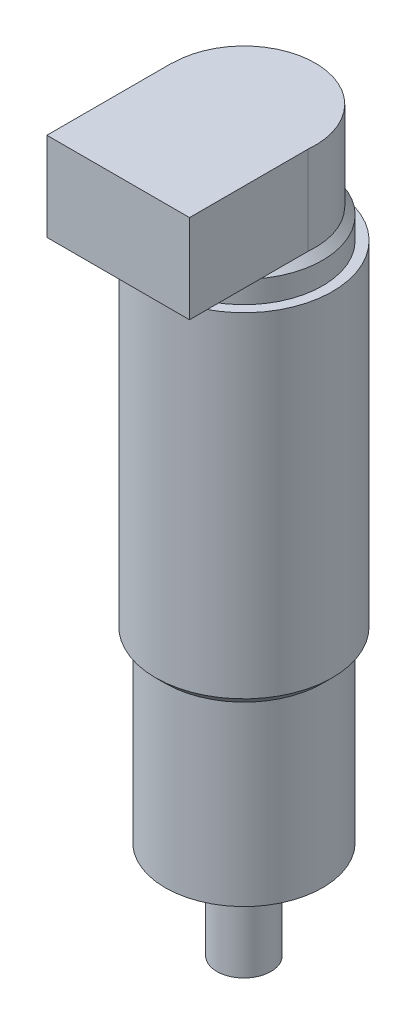
ISO-10303-21;
HEADER;
FILE_DESCRIPTION(('STEP AP214'),'2;1');
FILE_NAME('part.step','',(''),(''),'','','');
FILE_SCHEMA(('AUTOMOTIVE_DESIGN { 1 0 10303 214 1 1 1 1 }'));
ENDSEC;
DATA;
#1=APPLICATION_CONTEXT('core data for automotive mechanical design processes');
#2=APPLICATION_PROTOCOL_DEFINITION('international standard','automotive_design',2000,#1);
#3=PRODUCT_CONTEXT('',#1,'mechanical');
#4=PRODUCT('Part','Part','',(#3));
#5=PRODUCT_RELATED_PRODUCT_CATEGORY('part','',(#4));
#6=PRODUCT_DEFINITION_FORMATION('','',#4);
#7=PRODUCT_DEFINITION_CONTEXT('part definition',#1,'design');
#8=PRODUCT_DEFINITION('design','',#6,#7);
#9=PRODUCT_DEFINITION_SHAPE('','',#8);
#10=(LENGTH_UNIT() NAMED_UNIT(*) SI_UNIT(.MILLI.,.METRE.));
#11=(NAMED_UNIT(*) PLANE_ANGLE_UNIT() SI_UNIT($,.RADIAN.));
#12=(NAMED_UNIT(*) SI_UNIT($,.STERADIAN.) SOLID_ANGLE_UNIT());
#13=UNCERTAINTY_MEASURE_WITH_UNIT(LENGTH_MEASURE(1.E-05),#10,'distance_accuracy_value','');
#14=(GEOMETRIC_REPRESENTATION_CONTEXT(3) GLOBAL_UNCERTAINTY_ASSIGNED_CONTEXT((#13)) GLOBAL_UNIT_ASSIGNED_CONTEXT((#10,
#11,#12)) REPRESENTATION_CONTEXT('',''));
#15=CARTESIAN_POINT('',(0.,0.,0.));
#16=DIRECTION('',(0.,0.,1.));
#17=DIRECTION('',(1.,0.,0.));
#18=AXIS2_PLACEMENT_3D('',#15,#16,#17);
#19=CARTESIAN_POINT('',(0.,0.,0.));
#20=DIRECTION('',(0.,1.,0.));
#21=DIRECTION('',(0.,0.,1.));
#22=AXIS2_PLACEMENT_3D('',#19,#20,#21);
#23=PLANE('',#22);
#24=CARTESIAN_POINT('',(0.,0.,0.));
#25=DIRECTION('',(0.,1.,0.));
#26=DIRECTION('',(0.,0.,1.));
#27=AXIS2_PLACEMENT_3D('',#24,#25,#26);
#28=CIRCLE('',#27,16.);
#29=CARTESIAN_POINT('',(0.,0.,16.));
#30=VERTEX_POINT('',#29);
#31=EDGE_CURVE('E124',#30,#30,#28,.T.);
#32=ORIENTED_EDGE('',*,*,#31,.F.);
#33=EDGE_LOOP('',(#32));
#34=FACE_BOUND('',#33,.T.);
#35=CARTESIAN_POINT('',(0.,0.,0.));
#36=DIRECTION('',(0.,1.,0.));
#37=DIRECTION('',(0.,0.,1.));
#38=AXIS2_PLACEMENT_3D('',#35,#36,#37);
#39=CIRCLE('',#38,5.5);
#40=CARTESIAN_POINT('',(0.,0.,5.5));
#41=VERTEX_POINT('',#40);
#42=EDGE_CURVE('E11',#41,#41,#39,.F.);
#43=ORIENTED_EDGE('',*,*,#42,.F.);
#44=EDGE_LOOP('',(#43));
#45=FACE_BOUND('',#44,.T.);
#46=ADVANCED_FACE('F32',(#34,#45),#23,.F.);
#47=CARTESIAN_POINT('',(0.,130.,0.));
#48=DIRECTION('',(0.,-1.,0.));
#49=DIRECTION('',(0.,0.,-1.));
#50=AXIS2_PLACEMENT_3D('',#47,#48,#49);
#51=CYLINDRICAL_SURFACE('',#50,14.5);
#52=DIRECTION('',(0.,-1.,0.));
#53=VECTOR('',#52,1.);
#54=CARTESIAN_POINT('',(14.436167806906,130.,1.35906550646009));
#55=LINE('',#54,#53);
#56=CARTESIAN_POINT('',(14.436167806906,112.,1.35906550646005));
#57=VERTEX_POINT('',#56);
#58=CARTESIAN_POINT('',(14.436167806906,130.,1.35906550646009));
#59=VERTEX_POINT('',#58);
#60=EDGE_CURVE('E106',#57,#59,#55,.F.);
#61=ORIENTED_EDGE('',*,*,#60,.F.);
#62=CARTESIAN_POINT('',(0.,112.,0.));
#63=DIRECTION('',(0.,1.,0.));
#64=DIRECTION('',(0.,0.,1.));
#65=AXIS2_PLACEMENT_3D('',#62,#63,#64);
#66=CIRCLE('',#65,14.5);
#67=CARTESIAN_POINT('',(-14.5,112.,0.));
#68=VERTEX_POINT('',#67);
#69=EDGE_CURVE('E117',#57,#68,#66,.T.);
#70=ORIENTED_EDGE('',*,*,#69,.T.);
#71=DIRECTION('',(0.,-1.,0.));
#72=VECTOR('',#71,1.);
#73=CARTESIAN_POINT('',(-14.5,130.,0.));
#74=LINE('',#73,#72);
#75=CARTESIAN_POINT('',(-14.5,130.,0.));
#76=VERTEX_POINT('',#75);
#77=EDGE_CURVE('E47',#76,#68,#74,.T.);
#78=ORIENTED_EDGE('',*,*,#77,.F.);
#79=CARTESIAN_POINT('',(0.,130.,0.));
#80=DIRECTION('',(0.,1.,0.));
#81=DIRECTION('',(0.,0.,1.));
#82=AXIS2_PLACEMENT_3D('',#79,#80,#81);
#83=CIRCLE('',#82,14.5);
#84=EDGE_CURVE('E51',#59,#76,#83,.T.);
#85=ORIENTED_EDGE('',*,*,#84,.F.);
#86=EDGE_LOOP('',(#61,#70,#78,#85));
#87=FACE_BOUND('',#86,.T.);
#88=ADVANCED_FACE('F142',(#87),#51,.T.);
#89=CARTESIAN_POINT('',(0.,106.,0.));
#90=DIRECTION('',(0.,1.,0.));
#91=DIRECTION('',(0.,0.,1.));
#92=AXIS2_PLACEMENT_3D('',#89,#90,#91);
#93=PLANE('',#92);
#94=CARTESIAN_POINT('',(0.,106.,0.));
#95=DIRECTION('',(0.,1.,0.));
#96=DIRECTION('',(0.,0.,1.));
#97=AXIS2_PLACEMENT_3D('',#94,#95,#96);
#98=CIRCLE('',#97,18.);
#99=CARTESIAN_POINT('',(0.,106.,18.));
#100=VERTEX_POINT('',#99);
#101=EDGE_CURVE('E121',#100,#100,#98,.T.);
#102=ORIENTED_EDGE('',*,*,#101,.T.);
#103=EDGE_LOOP('',(#102));
#104=FACE_BOUND('',#103,.T.);
#105=CARTESIAN_POINT('',(0.,106.,0.));
#106=DIRECTION('',(0.,1.,0.));
#107=DIRECTION('',(0.,0.,1.));
#108=AXIS2_PLACEMENT_3D('',#105,#106,#107);
#109=CIRCLE('',#108,16.);
#110=CARTESIAN_POINT('',(0.,106.,16.));
#111=VERTEX_POINT('',#110);
#112=EDGE_CURVE('E116',#111,#111,#109,.T.);
#113=ORIENTED_EDGE('',*,*,#112,.F.);
#114=EDGE_LOOP('',(#113));
#115=FACE_BOUND('',#114,.T.);
#116=ADVANCED_FACE('F172',(#104,#115),#93,.T.);
#117=CARTESIAN_POINT('',(0.,36.,0.));
#118=DIRECTION('',(0.,-1.,0.));
#119=DIRECTION('',(0.,0.,-1.));
#120=AXIS2_PLACEMENT_3D('',#117,#118,#119);
#121=CYLINDRICAL_SURFACE('',#120,16.);
#122=CARTESIAN_POINT('',(0.,36.,0.));
#123=DIRECTION('',(0.,1.,0.));
#124=DIRECTION('',(0.,0.,1.));
#125=AXIS2_PLACEMENT_3D('',#122,#123,#124);
#126=CIRCLE('',#125,16.);
#127=CARTESIAN_POINT('',(0.,36.,16.));
#128=VERTEX_POINT('',#127);
#129=EDGE_CURVE('E125',#128,#128,#126,.T.);
#130=ORIENTED_EDGE('',*,*,#129,.F.);
#131=EDGE_LOOP('',(#130));
#132=FACE_BOUND('',#131,.T.);
#133=ORIENTED_EDGE('',*,*,#31,.T.);
#134=EDGE_LOOP('',(#133));
#135=FACE_BOUND('',#134,.T.);
#136=ADVANCED_FACE('F180',(#132,#135),#121,.T.);
#137=CARTESIAN_POINT('',(0.,106.,0.));
#138=DIRECTION('',(0.,-1.,0.));
#139=DIRECTION('',(0.,0.,-1.));
#140=AXIS2_PLACEMENT_3D('',#137,#138,#139);
#141=CYLINDRICAL_SURFACE('',#140,18.);
#142=CARTESIAN_POINT('',(0.,38.,0.));
#143=DIRECTION('',(0.,1.,0.));
#144=DIRECTION('',(0.,0.,1.));
#145=AXIS2_PLACEMENT_3D('',#142,#143,#144);
#146=CIRCLE('',#145,18.);
#147=CARTESIAN_POINT('',(0.,38.,18.));
#148=VERTEX_POINT('',#147);
#149=EDGE_CURVE('E128',#148,#148,#146,.T.);
#150=ORIENTED_EDGE('',*,*,#149,.T.);
#151=EDGE_LOOP('',(#150));
#152=FACE_BOUND('',#151,.T.);
#153=ORIENTED_EDGE('',*,*,#101,.F.);
#154=EDGE_LOOP('',(#153));
#155=FACE_BOUND('',#154,.T.);
#156=ADVANCED_FACE('F178',(#152,#155),#141,.T.);
#157=CARTESIAN_POINT('',(0.,38.,0.));
#158=DIRECTION('',(0.,1.,0.));
#159=DIRECTION('',(0.,0.,1.));
#160=AXIS2_PLACEMENT_3D('',#157,#158,#159);
#161=CONICAL_SURFACE('',#160,18.,0.785398163397454);
#162=ORIENTED_EDGE('',*,*,#129,.T.);
#163=EDGE_LOOP('',(#162));
#164=FACE_BOUND('',#163,.T.);
#165=ORIENTED_EDGE('',*,*,#149,.F.);
#166=EDGE_LOOP('',(#165));
#167=FACE_BOUND('',#166,.T.);
#168=ADVANCED_FACE('F183',(#164,#167),#161,.T.);
#169=CARTESIAN_POINT('',(0.,112.,0.));
#170=DIRECTION('',(0.,-1.,0.));
#171=DIRECTION('',(0.,0.,-1.));
#172=AXIS2_PLACEMENT_3D('',#169,#170,#171);
#173=CYLINDRICAL_SURFACE('',#172,16.);
#174=CARTESIAN_POINT('',(0.,110.5,0.));
#175=DIRECTION('',(0.,1.,0.));
#176=DIRECTION('',(0.,0.,1.));
#177=AXIS2_PLACEMENT_3D('',#174,#175,#176);
#178=CIRCLE('',#177,16.);
#179=CARTESIAN_POINT('',(0.,110.5,16.));
#180=VERTEX_POINT('',#179);
#181=EDGE_CURVE('E40',#180,#180,#178,.F.);
#182=ORIENTED_EDGE('',*,*,#181,.T.);
#183=EDGE_LOOP('',(#182));
#184=FACE_BOUND('',#183,.T.);
#185=ORIENTED_EDGE('',*,*,#112,.T.);
#186=EDGE_LOOP('',(#185));
#187=FACE_BOUND('',#186,.T.);
#188=ADVANCED_FACE('F135',(#184,#187),#173,.T.);
#189=CARTESIAN_POINT('',(0.,130.,0.));
#190=DIRECTION('',(0.,1.,0.));
#191=DIRECTION('',(0.,0.,1.));
#192=AXIS2_PLACEMENT_3D('',#189,#190,#191);
#193=PLANE('',#192);
#194=ORIENTED_EDGE('',*,*,#84,.T.);
#195=DIRECTION('',(-1.,0.,0.));
#196=VECTOR('',#195,1.);
#197=CARTESIAN_POINT('',(-14.563832193094,130.,0.));
#198=LINE('',#197,#196);
#199=CARTESIAN_POINT('',(-14.563832193094,130.,0.));
#200=VERTEX_POINT('',#199);
#201=EDGE_CURVE('E101',#76,#200,#198,.T.);
#202=ORIENTED_EDGE('',*,*,#201,.T.);
#203=DIRECTION('',(0.,0.,-1.));
#204=VECTOR('',#203,1.);
#205=CARTESIAN_POINT('',(-14.563832193094,130.,25.5));
#206=LINE('',#205,#204);
#207=CARTESIAN_POINT('',(-14.563832193094,130.,25.5));
#208=VERTEX_POINT('',#207);
#209=EDGE_CURVE('E149',#208,#200,#206,.T.);
#210=ORIENTED_EDGE('',*,*,#209,.F.);
#211=DIRECTION('',(-1.,0.,0.));
#212=VECTOR('',#211,1.);
#213=CARTESIAN_POINT('',(-14.563832193094,130.,25.5));
#214=LINE('',#213,#212);
#215=CARTESIAN_POINT('',(14.436167806906,130.,25.5));
#216=VERTEX_POINT('',#215);
#217=EDGE_CURVE('E97',#216,#208,#214,.T.);
#218=ORIENTED_EDGE('',*,*,#217,.F.);
#219=DIRECTION('',(0.,0.,-1.));
#220=VECTOR('',#219,1.);
#221=CARTESIAN_POINT('',(14.436167806906,130.,25.5));
#222=LINE('',#221,#220);
#223=EDGE_CURVE('E109',#216,#59,#222,.T.);
#224=ORIENTED_EDGE('',*,*,#223,.T.);
#225=EDGE_LOOP('',(#194,#202,#210,#218,#224));
#226=FACE_BOUND('',#225,.T.);
#227=ADVANCED_FACE('F141',(#226),#193,.T.);
#228=CARTESIAN_POINT('',(0.,112.,0.));
#229=DIRECTION('',(0.,-1.,0.));
#230=DIRECTION('',(0.,0.,-1.));
#231=AXIS2_PLACEMENT_3D('',#228,#229,#230);
#232=CONICAL_SURFACE('',#231,14.5,0.785398163397453);
#233=ORIENTED_EDGE('',*,*,#181,.F.);
#234=EDGE_LOOP('',(#233));
#235=FACE_BOUND('',#234,.T.);
#236=ORIENTED_EDGE('',*,*,#69,.F.);
#237=EDGE_CURVE('E114',#68,#57,#66,.T.);
#238=ORIENTED_EDGE('',*,*,#237,.F.);
#239=EDGE_LOOP('',(#236,#238));
#240=FACE_BOUND('',#239,.T.);
#241=ADVANCED_FACE('F34',(#235,#240),#232,.T.);
#242=CARTESIAN_POINT('',(0.,0.,0.));
#243=DIRECTION('',(0.,0.,1.));
#244=DIRECTION('',(1.,0.,0.));
#245=AXIS2_PLACEMENT_3D('',#242,#243,#244);
#246=PLANE('',#245);
#247=ORIENTED_EDGE('',*,*,#201,.F.);
#248=ORIENTED_EDGE('',*,*,#77,.T.);
#249=DIRECTION('',(1.,0.,0.));
#250=VECTOR('',#249,1.);
#251=CARTESIAN_POINT('',(-14.563832193094,112.,0.));
#252=LINE('',#251,#250);
#253=CARTESIAN_POINT('',(-14.563832193094,112.,0.));
#254=VERTEX_POINT('',#253);
#255=EDGE_CURVE('E146',#254,#68,#252,.T.);
#256=ORIENTED_EDGE('',*,*,#255,.F.);
#257=DIRECTION('',(0.,-1.,0.));
#258=VECTOR('',#257,1.);
#259=CARTESIAN_POINT('',(-14.563832193094,130.,0.));
#260=LINE('',#259,#258);
#261=EDGE_CURVE('E105',#200,#254,#260,.T.);
#262=ORIENTED_EDGE('',*,*,#261,.F.);
#263=EDGE_LOOP('',(#247,#248,#256,#262));
#264=FACE_BOUND('',#263,.T.);
#265=ADVANCED_FACE('F140',(#264),#246,.F.);
#266=CARTESIAN_POINT('',(14.436167806906,130.,25.5));
#267=DIRECTION('',(-1.,0.,0.));
#268=DIRECTION('',(0.,-1.,0.));
#269=AXIS2_PLACEMENT_3D('',#266,#267,#268);
#270=PLANE('',#269);
#271=DIRECTION('',(0.,0.,-1.));
#272=VECTOR('',#271,1.);
#273=CARTESIAN_POINT('',(14.436167806906,112.,25.5));
#274=LINE('',#273,#272);
#275=CARTESIAN_POINT('',(14.436167806906,112.,25.5));
#276=VERTEX_POINT('',#275);
#277=EDGE_CURVE('E88',#276,#57,#274,.T.);
#278=ORIENTED_EDGE('',*,*,#277,.T.);
#279=ORIENTED_EDGE('',*,*,#60,.T.);
#280=ORIENTED_EDGE('',*,*,#223,.F.);
#281=DIRECTION('',(0.,1.,0.));
#282=VECTOR('',#281,1.);
#283=CARTESIAN_POINT('',(14.436167806906,130.,25.5));
#284=LINE('',#283,#282);
#285=EDGE_CURVE('E91',#276,#216,#284,.T.);
#286=ORIENTED_EDGE('',*,*,#285,.F.);
#287=EDGE_LOOP('',(#278,#279,#280,#286));
#288=FACE_BOUND('',#287,.T.);
#289=ADVANCED_FACE('F147',(#288),#270,.F.);
#290=CARTESIAN_POINT('',(-14.563832193094,130.,25.5));
#291=DIRECTION('',(1.,0.,0.));
#292=DIRECTION('',(0.,1.,0.));
#293=AXIS2_PLACEMENT_3D('',#290,#291,#292);
#294=PLANE('',#293);
#295=ORIENTED_EDGE('',*,*,#261,.T.);
#296=DIRECTION('',(0.,0.,-1.));
#297=VECTOR('',#296,1.);
#298=CARTESIAN_POINT('',(-14.563832193094,112.,25.5));
#299=LINE('',#298,#297);
#300=CARTESIAN_POINT('',(-14.563832193094,112.,25.5));
#301=VERTEX_POINT('',#300);
#302=EDGE_CURVE('E85',#301,#254,#299,.T.);
#303=ORIENTED_EDGE('',*,*,#302,.F.);
#304=DIRECTION('',(0.,-1.,0.));
#305=VECTOR('',#304,1.);
#306=CARTESIAN_POINT('',(-14.563832193094,130.,25.5));
#307=LINE('',#306,#305);
#308=EDGE_CURVE('E92',#208,#301,#307,.T.);
#309=ORIENTED_EDGE('',*,*,#308,.F.);
#310=ORIENTED_EDGE('',*,*,#209,.T.);
#311=EDGE_LOOP('',(#295,#303,#309,#310));
#312=FACE_BOUND('',#311,.T.);
#313=ADVANCED_FACE('F103',(#312),#294,.F.);
#314=CARTESIAN_POINT('',(-14.563832193094,112.,25.5));
#315=DIRECTION('',(0.,1.,0.));
#316=DIRECTION('',(0.,0.,1.));
#317=AXIS2_PLACEMENT_3D('',#314,#315,#316);
#318=PLANE('',#317);
#319=ORIENTED_EDGE('',*,*,#237,.T.);
#320=ORIENTED_EDGE('',*,*,#277,.F.);
#321=DIRECTION('',(1.,0.,0.));
#322=VECTOR('',#321,1.);
#323=CARTESIAN_POINT('',(-14.563832193094,112.,25.5));
#324=LINE('',#323,#322);
#325=EDGE_CURVE('E79',#301,#276,#324,.T.);
#326=ORIENTED_EDGE('',*,*,#325,.F.);
#327=ORIENTED_EDGE('',*,*,#302,.T.);
#328=ORIENTED_EDGE('',*,*,#255,.T.);
#329=EDGE_LOOP('',(#319,#320,#326,#327,#328));
#330=FACE_BOUND('',#329,.T.);
#331=ADVANCED_FACE('F82',(#330),#318,.F.);
#332=CARTESIAN_POINT('',(0.,0.,25.5));
#333=DIRECTION('',(0.,0.,1.));
#334=DIRECTION('',(1.,0.,0.));
#335=AXIS2_PLACEMENT_3D('',#332,#333,#334);
#336=PLANE('',#335);
#337=ORIENTED_EDGE('',*,*,#308,.T.);
#338=ORIENTED_EDGE('',*,*,#325,.T.);
#339=ORIENTED_EDGE('',*,*,#285,.T.);
#340=ORIENTED_EDGE('',*,*,#217,.T.);
#341=EDGE_LOOP('',(#337,#338,#339,#340));
#342=FACE_BOUND('',#341,.T.);
#343=ADVANCED_FACE('F95',(#342),#336,.T.);
#344=CARTESIAN_POINT('',(0.,-20.,0.));
#345=DIRECTION('',(0.,1.,0.));
#346=DIRECTION('',(0.,0.,1.));
#347=AXIS2_PLACEMENT_3D('',#344,#345,#346);
#348=CYLINDRICAL_SURFACE('',#347,5.5);
#349=CARTESIAN_POINT('',(0.,-20.,0.));
#350=DIRECTION('',(0.,-1.,0.));
#351=DIRECTION('',(0.,0.,-1.));
#352=AXIS2_PLACEMENT_3D('',#349,#350,#351);
#353=CIRCLE('',#352,5.5);
#354=CARTESIAN_POINT('',(0.,-20.,-5.5));
#355=VERTEX_POINT('',#354);
#356=EDGE_CURVE('E153',#355,#355,#353,.T.);
#357=ORIENTED_EDGE('',*,*,#356,.F.);
#358=EDGE_LOOP('',(#357));
#359=FACE_BOUND('',#358,.T.);
#360=ORIENTED_EDGE('',*,*,#42,.T.);
#361=EDGE_LOOP('',(#360));
#362=FACE_BOUND('',#361,.T.);
#363=ADVANCED_FACE('F212',(#359,#362),#348,.T.);
#364=CARTESIAN_POINT('',(0.,-20.,0.));
#365=DIRECTION('',(0.,-1.,0.));
#366=DIRECTION('',(0.,0.,-1.));
#367=AXIS2_PLACEMENT_3D('',#364,#365,#366);
#368=PLANE('',#367);
#369=ORIENTED_EDGE('',*,*,#356,.T.);
#370=EDGE_LOOP('',(#369));
#371=FACE_BOUND('',#370,.T.);
#372=ADVANCED_FACE('F216',(#371),#368,.T.);
#373=CLOSED_SHELL('',(#46,#88,#116,#136,#156,#168,#188,#227,#241,#265,#289,#313,#331,#343,#363,#372));
#374=MANIFOLD_SOLID_BREP('B2',#373);
#375=ADVANCED_BREP_SHAPE_REPRESENTATION('',(#18,#374),#14);
#376=SHAPE_DEFINITION_REPRESENTATION(#9,#375);
ENDSEC;
END-ISO-10303-21;
